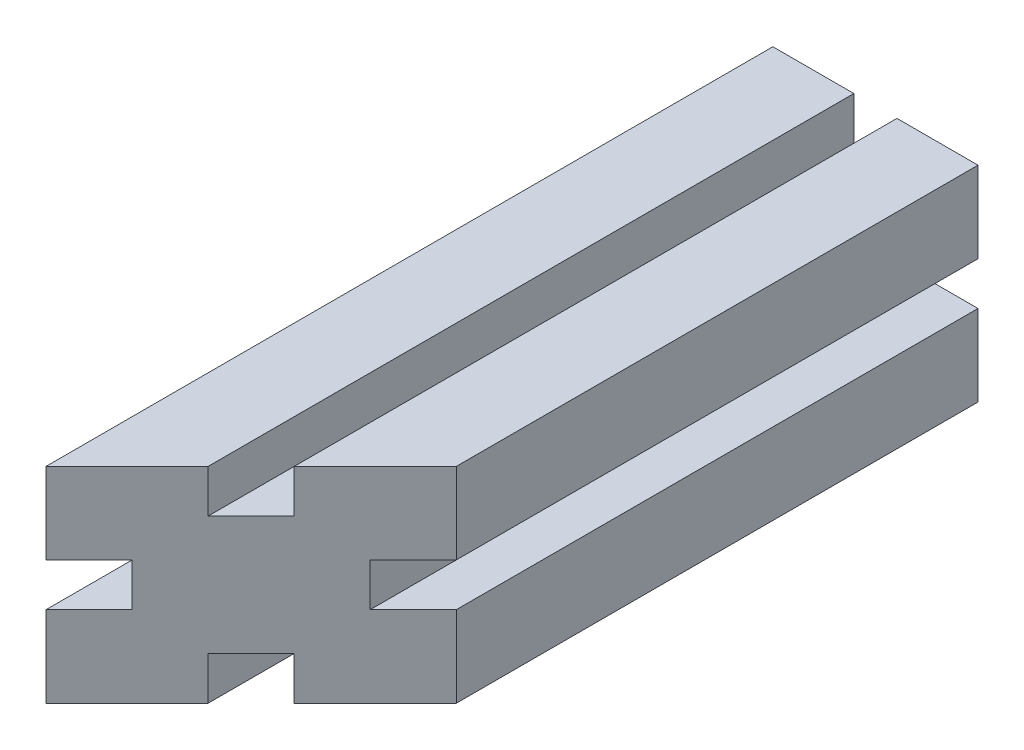
ISO-10303-21;
HEADER;
FILE_DESCRIPTION(('STEP AP214'),'2;1');
FILE_NAME('part.step','',(''),(''),'','','');
FILE_SCHEMA(('AUTOMOTIVE_DESIGN { 1 0 10303 214 1 1 1 1 }'));
ENDSEC;
DATA;
#1=APPLICATION_CONTEXT('core data for automotive mechanical design processes');
#2=APPLICATION_PROTOCOL_DEFINITION('international standard','automotive_design',2000,#1);
#3=PRODUCT_CONTEXT('',#1,'mechanical');
#4=PRODUCT('Part','Part','',(#3));
#5=PRODUCT_RELATED_PRODUCT_CATEGORY('part','',(#4));
#6=PRODUCT_DEFINITION_FORMATION('','',#4);
#7=PRODUCT_DEFINITION_CONTEXT('part definition',#1,'design');
#8=PRODUCT_DEFINITION('design','',#6,#7);
#9=PRODUCT_DEFINITION_SHAPE('','',#8);
#10=(LENGTH_UNIT() NAMED_UNIT(*) SI_UNIT(.MILLI.,.METRE.));
#11=(NAMED_UNIT(*) PLANE_ANGLE_UNIT() SI_UNIT($,.RADIAN.));
#12=(NAMED_UNIT(*) SI_UNIT($,.STERADIAN.) SOLID_ANGLE_UNIT());
#13=UNCERTAINTY_MEASURE_WITH_UNIT(LENGTH_MEASURE(1.E-05),#10,'distance_accuracy_value','');
#14=(GEOMETRIC_REPRESENTATION_CONTEXT(3) GLOBAL_UNCERTAINTY_ASSIGNED_CONTEXT((#13)) GLOBAL_UNIT_ASSIGNED_CONTEXT((#10,
#11,#12)) REPRESENTATION_CONTEXT('',''));
#15=CARTESIAN_POINT('',(0.,0.,0.));
#16=DIRECTION('',(0.,0.,1.));
#17=DIRECTION('',(1.,0.,0.));
#18=AXIS2_PLACEMENT_3D('',#15,#16,#17);
#19=CARTESIAN_POINT('',(-19.05,-4.,135.));
#20=DIRECTION('',(1.,0.,0.));
#21=DIRECTION('',(0.,0.,-1.));
#22=AXIS2_PLACEMENT_3D('',#19,#20,#21);
#23=PLANE('',#22);
#24=DIRECTION('',(0.,-1.,0.));
#25=VECTOR('',#24,1.);
#26=CARTESIAN_POINT('',(-19.05,-4.,0.));
#27=LINE('',#26,#25);
#28=CARTESIAN_POINT('',(-19.05,-4.,0.));
#29=VERTEX_POINT('',#28);
#30=CARTESIAN_POINT('',(-19.05,-19.05,0.));
#31=VERTEX_POINT('',#30);
#32=EDGE_CURVE('E142',#29,#31,#27,.T.);
#33=ORIENTED_EDGE('',*,*,#32,.T.);
#34=DIRECTION('',(0.,0.,-1.));
#35=VECTOR('',#34,1.);
#36=CARTESIAN_POINT('',(-19.05,-19.05,135.));
#37=LINE('',#36,#35);
#38=CARTESIAN_POINT('',(-19.05,-19.05,135.));
#39=VERTEX_POINT('',#38);
#40=EDGE_CURVE('E11',#39,#31,#37,.T.);
#41=ORIENTED_EDGE('',*,*,#40,.F.);
#42=DIRECTION('',(0.,-1.,0.));
#43=VECTOR('',#42,1.);
#44=CARTESIAN_POINT('',(-19.05,-4.,135.));
#45=LINE('',#44,#43);
#46=CARTESIAN_POINT('',(-19.05,-4.,135.));
#47=VERTEX_POINT('',#46);
#48=EDGE_CURVE('E143',#47,#39,#45,.T.);
#49=ORIENTED_EDGE('',*,*,#48,.F.);
#50=DIRECTION('',(0.,0.,-1.));
#51=VECTOR('',#50,1.);
#52=CARTESIAN_POINT('',(-19.05,-4.,135.));
#53=LINE('',#52,#51);
#54=EDGE_CURVE('E128',#47,#29,#53,.T.);
#55=ORIENTED_EDGE('',*,*,#54,.T.);
#56=EDGE_LOOP('',(#33,#41,#49,#55));
#57=FACE_BOUND('',#56,.T.);
#58=ADVANCED_FACE('F39',(#57),#23,.F.);
#59=CARTESIAN_POINT('',(-19.05,-19.05,135.));
#60=DIRECTION('',(0.,1.,0.));
#61=DIRECTION('',(0.,0.,1.));
#62=AXIS2_PLACEMENT_3D('',#59,#60,#61);
#63=PLANE('',#62);
#64=DIRECTION('',(0.,0.,-1.));
#65=VECTOR('',#64,1.);
#66=CARTESIAN_POINT('',(-4.,-19.05,135.));
#67=LINE('',#66,#65);
#68=CARTESIAN_POINT('',(-4.,-19.05,119.95));
#69=VERTEX_POINT('',#68);
#70=CARTESIAN_POINT('',(-4.,-19.05,0.));
#71=VERTEX_POINT('',#70);
#72=EDGE_CURVE('E47',#69,#71,#67,.T.);
#73=ORIENTED_EDGE('',*,*,#72,.F.);
#74=DIRECTION('',(-0.707106781186548,0.,0.707106781186548));
#75=VECTOR('',#74,1.);
#76=CARTESIAN_POINT('',(-19.05,-19.05,135.));
#77=LINE('',#76,#75);
#78=EDGE_CURVE('E313',#69,#39,#77,.T.);
#79=ORIENTED_EDGE('',*,*,#78,.T.);
#80=ORIENTED_EDGE('',*,*,#40,.T.);
#81=DIRECTION('',(1.,0.,0.));
#82=VECTOR('',#81,1.);
#83=CARTESIAN_POINT('',(-19.05,-19.05,0.));
#84=LINE('',#83,#82);
#85=EDGE_CURVE('E197',#31,#71,#84,.T.);
#86=ORIENTED_EDGE('',*,*,#85,.T.);
#87=EDGE_LOOP('',(#73,#79,#80,#86));
#88=FACE_BOUND('',#87,.T.);
#89=ADVANCED_FACE('F198',(#88),#63,.F.);
#90=CARTESIAN_POINT('',(-4.,-19.05,135.));
#91=DIRECTION('',(-1.,0.,0.));
#92=DIRECTION('',(0.,0.,1.));
#93=AXIS2_PLACEMENT_3D('',#90,#91,#92);
#94=PLANE('',#93);
#95=DIRECTION('',(0.,0.,-1.));
#96=VECTOR('',#95,1.);
#97=CARTESIAN_POINT('',(-4.,-11.05,135.));
#98=LINE('',#97,#96);
#99=CARTESIAN_POINT('',(-4.,-11.05,119.95));
#100=VERTEX_POINT('',#99);
#101=CARTESIAN_POINT('',(-4.,-11.05,0.));
#102=VERTEX_POINT('',#101);
#103=EDGE_CURVE('E181',#100,#102,#98,.T.);
#104=ORIENTED_EDGE('',*,*,#103,.F.);
#105=DIRECTION('',(0.,-1.,0.));
#106=VECTOR('',#105,1.);
#107=CARTESIAN_POINT('',(-4.,-19.05,119.95));
#108=LINE('',#107,#106);
#109=EDGE_CURVE('E194',#100,#69,#108,.T.);
#110=ORIENTED_EDGE('',*,*,#109,.T.);
#111=ORIENTED_EDGE('',*,*,#72,.T.);
#112=DIRECTION('',(0.,1.,0.));
#113=VECTOR('',#112,1.);
#114=CARTESIAN_POINT('',(-4.,-19.05,0.));
#115=LINE('',#114,#113);
#116=EDGE_CURVE('E190',#71,#102,#115,.T.);
#117=ORIENTED_EDGE('',*,*,#116,.T.);
#118=EDGE_LOOP('',(#104,#110,#111,#117));
#119=FACE_BOUND('',#118,.T.);
#120=ADVANCED_FACE('F188',(#119),#94,.F.);
#121=CARTESIAN_POINT('',(-4.,-11.05,135.));
#122=DIRECTION('',(0.,1.,0.));
#123=DIRECTION('',(0.,0.,1.));
#124=AXIS2_PLACEMENT_3D('',#121,#122,#123);
#125=PLANE('',#124);
#126=DIRECTION('',(0.,0.,-1.));
#127=VECTOR('',#126,1.);
#128=CARTESIAN_POINT('',(4.,-11.05,135.));
#129=LINE('',#128,#127);
#130=CARTESIAN_POINT('',(4.,-11.05,111.95));
#131=VERTEX_POINT('',#130);
#132=CARTESIAN_POINT('',(4.,-11.05,0.));
#133=VERTEX_POINT('',#132);
#134=EDGE_CURVE('E179',#131,#133,#129,.T.);
#135=ORIENTED_EDGE('',*,*,#134,.F.);
#136=DIRECTION('',(-0.707106781186548,0.,0.707106781186548));
#137=VECTOR('',#136,1.);
#138=CARTESIAN_POINT('',(-11.525,-11.05,127.475));
#139=LINE('',#138,#137);
#140=EDGE_CURVE('E310',#131,#100,#139,.T.);
#141=ORIENTED_EDGE('',*,*,#140,.T.);
#142=ORIENTED_EDGE('',*,*,#103,.T.);
#143=DIRECTION('',(1.,0.,0.));
#144=VECTOR('',#143,1.);
#145=CARTESIAN_POINT('',(-4.,-11.05,0.));
#146=LINE('',#145,#144);
#147=EDGE_CURVE('E203',#102,#133,#146,.T.);
#148=ORIENTED_EDGE('',*,*,#147,.T.);
#149=EDGE_LOOP('',(#135,#141,#142,#148));
#150=FACE_BOUND('',#149,.T.);
#151=ADVANCED_FACE('F317',(#150),#125,.F.);
#152=CARTESIAN_POINT('',(4.,-11.05,135.));
#153=DIRECTION('',(1.,0.,0.));
#154=DIRECTION('',(0.,0.,-1.));
#155=AXIS2_PLACEMENT_3D('',#152,#153,#154);
#156=PLANE('',#155);
#157=DIRECTION('',(0.,0.,-1.));
#158=VECTOR('',#157,1.);
#159=CARTESIAN_POINT('',(4.,-19.05,135.));
#160=LINE('',#159,#158);
#161=CARTESIAN_POINT('',(4.,-19.05,111.95));
#162=VERTEX_POINT('',#161);
#163=CARTESIAN_POINT('',(4.,-19.05,0.));
#164=VERTEX_POINT('',#163);
#165=EDGE_CURVE('E177',#162,#164,#160,.T.);
#166=ORIENTED_EDGE('',*,*,#165,.F.);
#167=DIRECTION('',(0.,1.,0.));
#168=VECTOR('',#167,1.);
#169=CARTESIAN_POINT('',(4.,-11.05,111.95));
#170=LINE('',#169,#168);
#171=EDGE_CURVE('E318',#162,#131,#170,.T.);
#172=ORIENTED_EDGE('',*,*,#171,.T.);
#173=ORIENTED_EDGE('',*,*,#134,.T.);
#174=DIRECTION('',(0.,-1.,0.));
#175=VECTOR('',#174,1.);
#176=CARTESIAN_POINT('',(4.,-11.05,0.));
#177=LINE('',#176,#175);
#178=EDGE_CURVE('E205',#133,#164,#177,.T.);
#179=ORIENTED_EDGE('',*,*,#178,.T.);
#180=EDGE_LOOP('',(#166,#172,#173,#179));
#181=FACE_BOUND('',#180,.T.);
#182=ADVANCED_FACE('F418',(#181),#156,.F.);
#183=CARTESIAN_POINT('',(4.,-19.05,135.));
#184=DIRECTION('',(0.,1.,0.));
#185=DIRECTION('',(0.,0.,1.));
#186=AXIS2_PLACEMENT_3D('',#183,#184,#185);
#187=PLANE('',#186);
#188=DIRECTION('',(0.,0.,-1.));
#189=VECTOR('',#188,1.);
#190=CARTESIAN_POINT('',(19.05,-19.05,135.));
#191=LINE('',#190,#189);
#192=CARTESIAN_POINT('',(19.05,-19.05,96.9));
#193=VERTEX_POINT('',#192);
#194=CARTESIAN_POINT('',(19.05,-19.05,0.));
#195=VERTEX_POINT('',#194);
#196=EDGE_CURVE('E175',#193,#195,#191,.T.);
#197=ORIENTED_EDGE('',*,*,#196,.F.);
#198=EDGE_CURVE('E326',#193,#162,#77,.T.);
#199=ORIENTED_EDGE('',*,*,#198,.T.);
#200=ORIENTED_EDGE('',*,*,#165,.T.);
#201=DIRECTION('',(1.,0.,0.));
#202=VECTOR('',#201,1.);
#203=CARTESIAN_POINT('',(4.,-19.05,0.));
#204=LINE('',#203,#202);
#205=EDGE_CURVE('E211',#164,#195,#204,.T.);
#206=ORIENTED_EDGE('',*,*,#205,.T.);
#207=EDGE_LOOP('',(#197,#199,#200,#206));
#208=FACE_BOUND('',#207,.T.);
#209=ADVANCED_FACE('F363',(#208),#187,.F.);
#210=CARTESIAN_POINT('',(19.05,-19.05,135.));
#211=DIRECTION('',(-1.,0.,0.));
#212=DIRECTION('',(0.,0.,1.));
#213=AXIS2_PLACEMENT_3D('',#210,#211,#212);
#214=PLANE('',#213);
#215=DIRECTION('',(0.,0.,-1.));
#216=VECTOR('',#215,1.);
#217=CARTESIAN_POINT('',(19.05,-4.,135.));
#218=LINE('',#217,#216);
#219=CARTESIAN_POINT('',(19.05,-4.,96.9));
#220=VERTEX_POINT('',#219);
#221=CARTESIAN_POINT('',(19.05,-4.,0.));
#222=VERTEX_POINT('',#221);
#223=EDGE_CURVE('E173',#220,#222,#218,.T.);
#224=ORIENTED_EDGE('',*,*,#223,.F.);
#225=DIRECTION('',(0.,-1.,0.));
#226=VECTOR('',#225,1.);
#227=CARTESIAN_POINT('',(19.05,-19.05,96.9));
#228=LINE('',#227,#226);
#229=EDGE_CURVE('E320',#220,#193,#228,.T.);
#230=ORIENTED_EDGE('',*,*,#229,.T.);
#231=ORIENTED_EDGE('',*,*,#196,.T.);
#232=DIRECTION('',(0.,1.,0.));
#233=VECTOR('',#232,1.);
#234=CARTESIAN_POINT('',(19.05,-19.05,0.));
#235=LINE('',#234,#233);
#236=EDGE_CURVE('E214',#195,#222,#235,.T.);
#237=ORIENTED_EDGE('',*,*,#236,.T.);
#238=EDGE_LOOP('',(#224,#230,#231,#237));
#239=FACE_BOUND('',#238,.T.);
#240=ADVANCED_FACE('F361',(#239),#214,.F.);
#241=CARTESIAN_POINT('',(19.05,-4.,135.));
#242=DIRECTION('',(0.,-1.,0.));
#243=DIRECTION('',(0.,0.,-1.));
#244=AXIS2_PLACEMENT_3D('',#241,#242,#243);
#245=PLANE('',#244);
#246=DIRECTION('',(0.,0.,-1.));
#247=VECTOR('',#246,1.);
#248=CARTESIAN_POINT('',(11.05,-4.,135.));
#249=LINE('',#248,#247);
#250=CARTESIAN_POINT('',(11.05,-4.,104.9));
#251=VERTEX_POINT('',#250);
#252=CARTESIAN_POINT('',(11.05,-4.,0.));
#253=VERTEX_POINT('',#252);
#254=EDGE_CURVE('E171',#251,#253,#249,.T.);
#255=ORIENTED_EDGE('',*,*,#254,.F.);
#256=DIRECTION('',(0.707106781186548,0.,-0.707106781186548));
#257=VECTOR('',#256,1.);
#258=CARTESIAN_POINT('',(0.,-4.,115.95));
#259=LINE('',#258,#257);
#260=EDGE_CURVE('E355',#251,#220,#259,.T.);
#261=ORIENTED_EDGE('',*,*,#260,.T.);
#262=ORIENTED_EDGE('',*,*,#223,.T.);
#263=DIRECTION('',(-1.,0.,0.));
#264=VECTOR('',#263,1.);
#265=CARTESIAN_POINT('',(19.05,-4.,0.));
#266=LINE('',#265,#264);
#267=EDGE_CURVE('E217',#222,#253,#266,.T.);
#268=ORIENTED_EDGE('',*,*,#267,.T.);
#269=EDGE_LOOP('',(#255,#261,#262,#268));
#270=FACE_BOUND('',#269,.T.);
#271=ADVANCED_FACE('F372',(#270),#245,.F.);
#272=CARTESIAN_POINT('',(11.05,-4.,135.));
#273=DIRECTION('',(-1.,0.,0.));
#274=DIRECTION('',(0.,0.,1.));
#275=AXIS2_PLACEMENT_3D('',#272,#273,#274);
#276=PLANE('',#275);
#277=DIRECTION('',(0.,0.,-1.));
#278=VECTOR('',#277,1.);
#279=CARTESIAN_POINT('',(11.05,4.,135.));
#280=LINE('',#279,#278);
#281=CARTESIAN_POINT('',(11.05,4.,104.9));
#282=VERTEX_POINT('',#281);
#283=CARTESIAN_POINT('',(11.05,4.,0.));
#284=VERTEX_POINT('',#283);
#285=EDGE_CURVE('E169',#282,#284,#280,.T.);
#286=ORIENTED_EDGE('',*,*,#285,.F.);
#287=DIRECTION('',(0.,-1.,0.));
#288=VECTOR('',#287,1.);
#289=CARTESIAN_POINT('',(11.05,-4.,104.9));
#290=LINE('',#289,#288);
#291=EDGE_CURVE('E352',#282,#251,#290,.T.);
#292=ORIENTED_EDGE('',*,*,#291,.T.);
#293=ORIENTED_EDGE('',*,*,#254,.T.);
#294=DIRECTION('',(0.,1.,0.));
#295=VECTOR('',#294,1.);
#296=CARTESIAN_POINT('',(11.05,-4.,0.));
#297=LINE('',#296,#295);
#298=EDGE_CURVE('E220',#253,#284,#297,.T.);
#299=ORIENTED_EDGE('',*,*,#298,.T.);
#300=EDGE_LOOP('',(#286,#292,#293,#299));
#301=FACE_BOUND('',#300,.T.);
#302=ADVANCED_FACE('F375',(#301),#276,.F.);
#303=CARTESIAN_POINT('',(11.05,4.,135.));
#304=DIRECTION('',(0.,1.,0.));
#305=DIRECTION('',(0.,0.,1.));
#306=AXIS2_PLACEMENT_3D('',#303,#304,#305);
#307=PLANE('',#306);
#308=DIRECTION('',(0.,0.,-1.));
#309=VECTOR('',#308,1.);
#310=CARTESIAN_POINT('',(19.05,4.,135.));
#311=LINE('',#310,#309);
#312=CARTESIAN_POINT('',(19.05,4.,96.9));
#313=VERTEX_POINT('',#312);
#314=CARTESIAN_POINT('',(19.05,4.,0.));
#315=VERTEX_POINT('',#314);
#316=EDGE_CURVE('E167',#313,#315,#311,.T.);
#317=ORIENTED_EDGE('',*,*,#316,.F.);
#318=DIRECTION('',(-0.707106781186548,0.,0.707106781186548));
#319=VECTOR('',#318,1.);
#320=CARTESIAN_POINT('',(-4.,4.,119.95));
#321=LINE('',#320,#319);
#322=EDGE_CURVE('E349',#313,#282,#321,.T.);
#323=ORIENTED_EDGE('',*,*,#322,.T.);
#324=ORIENTED_EDGE('',*,*,#285,.T.);
#325=DIRECTION('',(1.,0.,0.));
#326=VECTOR('',#325,1.);
#327=CARTESIAN_POINT('',(11.05,4.,0.));
#328=LINE('',#327,#326);
#329=EDGE_CURVE('E223',#284,#315,#328,.T.);
#330=ORIENTED_EDGE('',*,*,#329,.T.);
#331=EDGE_LOOP('',(#317,#323,#324,#330));
#332=FACE_BOUND('',#331,.T.);
#333=ADVANCED_FACE('F378',(#332),#307,.F.);
#334=CARTESIAN_POINT('',(19.05,4.,135.));
#335=DIRECTION('',(-1.,0.,0.));
#336=DIRECTION('',(0.,0.,1.));
#337=AXIS2_PLACEMENT_3D('',#334,#335,#336);
#338=PLANE('',#337);
#339=DIRECTION('',(0.,0.,-1.));
#340=VECTOR('',#339,1.);
#341=CARTESIAN_POINT('',(19.05,19.05,135.));
#342=LINE('',#341,#340);
#343=CARTESIAN_POINT('',(19.05,19.05,96.9));
#344=VERTEX_POINT('',#343);
#345=CARTESIAN_POINT('',(19.05,19.05,0.));
#346=VERTEX_POINT('',#345);
#347=EDGE_CURVE('E165',#344,#346,#342,.T.);
#348=ORIENTED_EDGE('',*,*,#347,.F.);
#349=DIRECTION('',(0.,-1.,0.));
#350=VECTOR('',#349,1.);
#351=CARTESIAN_POINT('',(19.05,4.,96.9));
#352=LINE('',#351,#350);
#353=EDGE_CURVE('E346',#344,#313,#352,.T.);
#354=ORIENTED_EDGE('',*,*,#353,.T.);
#355=ORIENTED_EDGE('',*,*,#316,.T.);
#356=DIRECTION('',(0.,1.,0.));
#357=VECTOR('',#356,1.);
#358=CARTESIAN_POINT('',(19.05,4.,0.));
#359=LINE('',#358,#357);
#360=EDGE_CURVE('E226',#315,#346,#359,.T.);
#361=ORIENTED_EDGE('',*,*,#360,.T.);
#362=EDGE_LOOP('',(#348,#354,#355,#361));
#363=FACE_BOUND('',#362,.T.);
#364=ADVANCED_FACE('F383',(#363),#338,.F.);
#365=CARTESIAN_POINT('',(19.05,19.05,135.));
#366=DIRECTION('',(0.,-1.,0.));
#367=DIRECTION('',(0.,0.,-1.));
#368=AXIS2_PLACEMENT_3D('',#365,#366,#367);
#369=PLANE('',#368);
#370=DIRECTION('',(0.,0.,-1.));
#371=VECTOR('',#370,1.);
#372=CARTESIAN_POINT('',(4.,19.05,135.));
#373=LINE('',#372,#371);
#374=CARTESIAN_POINT('',(4.,19.05,111.95));
#375=VERTEX_POINT('',#374);
#376=CARTESIAN_POINT('',(4.,19.05,0.));
#377=VERTEX_POINT('',#376);
#378=EDGE_CURVE('E163',#375,#377,#373,.T.);
#379=ORIENTED_EDGE('',*,*,#378,.F.);
#380=DIRECTION('',(-0.707106781186548,0.,0.707106781186548));
#381=VECTOR('',#380,1.);
#382=CARTESIAN_POINT('',(-19.05,19.05,135.));
#383=LINE('',#382,#381);
#384=EDGE_CURVE('E327',#344,#375,#383,.T.);
#385=ORIENTED_EDGE('',*,*,#384,.F.);
#386=ORIENTED_EDGE('',*,*,#347,.T.);
#387=DIRECTION('',(-1.,0.,0.));
#388=VECTOR('',#387,1.);
#389=CARTESIAN_POINT('',(19.05,19.05,0.));
#390=LINE('',#389,#388);
#391=EDGE_CURVE('E229',#346,#377,#390,.T.);
#392=ORIENTED_EDGE('',*,*,#391,.T.);
#393=EDGE_LOOP('',(#379,#385,#386,#392));
#394=FACE_BOUND('',#393,.T.);
#395=ADVANCED_FACE('F387',(#394),#369,.F.);
#396=CARTESIAN_POINT('',(4.,19.05,135.));
#397=DIRECTION('',(1.,0.,0.));
#398=DIRECTION('',(0.,0.,-1.));
#399=AXIS2_PLACEMENT_3D('',#396,#397,#398);
#400=PLANE('',#399);
#401=DIRECTION('',(0.,0.,-1.));
#402=VECTOR('',#401,1.);
#403=CARTESIAN_POINT('',(4.,11.05,135.));
#404=LINE('',#403,#402);
#405=CARTESIAN_POINT('',(4.,11.05,111.95));
#406=VERTEX_POINT('',#405);
#407=CARTESIAN_POINT('',(4.,11.05,0.));
#408=VERTEX_POINT('',#407);
#409=EDGE_CURVE('E161',#406,#408,#404,.T.);
#410=ORIENTED_EDGE('',*,*,#409,.F.);
#411=DIRECTION('',(0.,1.,0.));
#412=VECTOR('',#411,1.);
#413=CARTESIAN_POINT('',(4.,19.05,111.95));
#414=LINE('',#413,#412);
#415=EDGE_CURVE('E343',#406,#375,#414,.T.);
#416=ORIENTED_EDGE('',*,*,#415,.T.);
#417=ORIENTED_EDGE('',*,*,#378,.T.);
#418=DIRECTION('',(0.,-1.,0.));
#419=VECTOR('',#418,1.);
#420=CARTESIAN_POINT('',(4.,19.05,0.));
#421=LINE('',#420,#419);
#422=EDGE_CURVE('E232',#377,#408,#421,.T.);
#423=ORIENTED_EDGE('',*,*,#422,.T.);
#424=EDGE_LOOP('',(#410,#416,#417,#423));
#425=FACE_BOUND('',#424,.T.);
#426=ADVANCED_FACE('F391',(#425),#400,.F.);
#427=CARTESIAN_POINT('',(4.,11.05,135.));
#428=DIRECTION('',(0.,-1.,0.));
#429=DIRECTION('',(0.,0.,-1.));
#430=AXIS2_PLACEMENT_3D('',#427,#428,#429);
#431=PLANE('',#430);
#432=DIRECTION('',(0.,0.,-1.));
#433=VECTOR('',#432,1.);
#434=CARTESIAN_POINT('',(-4.,11.05,135.));
#435=LINE('',#434,#433);
#436=CARTESIAN_POINT('',(-4.,11.05,119.95));
#437=VERTEX_POINT('',#436);
#438=CARTESIAN_POINT('',(-4.,11.05,0.));
#439=VERTEX_POINT('',#438);
#440=EDGE_CURVE('E159',#437,#439,#435,.T.);
#441=ORIENTED_EDGE('',*,*,#440,.F.);
#442=DIRECTION('',(0.707106781186548,0.,-0.707106781186548));
#443=VECTOR('',#442,1.);
#444=CARTESIAN_POINT('',(-7.525,11.05,123.475));
#445=LINE('',#444,#443);
#446=EDGE_CURVE('E340',#437,#406,#445,.T.);
#447=ORIENTED_EDGE('',*,*,#446,.T.);
#448=ORIENTED_EDGE('',*,*,#409,.T.);
#449=DIRECTION('',(-1.,0.,0.));
#450=VECTOR('',#449,1.);
#451=CARTESIAN_POINT('',(4.,11.05,0.));
#452=LINE('',#451,#450);
#453=EDGE_CURVE('E235',#408,#439,#452,.T.);
#454=ORIENTED_EDGE('',*,*,#453,.T.);
#455=EDGE_LOOP('',(#441,#447,#448,#454));
#456=FACE_BOUND('',#455,.T.);
#457=ADVANCED_FACE('F395',(#456),#431,.F.);
#458=CARTESIAN_POINT('',(-4.,11.05,135.));
#459=DIRECTION('',(-1.,0.,0.));
#460=DIRECTION('',(0.,0.,1.));
#461=AXIS2_PLACEMENT_3D('',#458,#459,#460);
#462=PLANE('',#461);
#463=DIRECTION('',(0.,0.,-1.));
#464=VECTOR('',#463,1.);
#465=CARTESIAN_POINT('',(-4.,19.05,135.));
#466=LINE('',#465,#464);
#467=CARTESIAN_POINT('',(-3.99999999999999,19.05,119.95));
#468=VERTEX_POINT('',#467);
#469=CARTESIAN_POINT('',(-4.,19.05,0.));
#470=VERTEX_POINT('',#469);
#471=EDGE_CURVE('E157',#468,#470,#466,.T.);
#472=ORIENTED_EDGE('',*,*,#471,.F.);
#473=DIRECTION('',(0.,-1.,0.));
#474=VECTOR('',#473,1.);
#475=CARTESIAN_POINT('',(-4.,11.05,119.95));
#476=LINE('',#475,#474);
#477=EDGE_CURVE('E337',#468,#437,#476,.T.);
#478=ORIENTED_EDGE('',*,*,#477,.T.);
#479=ORIENTED_EDGE('',*,*,#440,.T.);
#480=DIRECTION('',(0.,1.,0.));
#481=VECTOR('',#480,1.);
#482=CARTESIAN_POINT('',(-4.,11.05,0.));
#483=LINE('',#482,#481);
#484=EDGE_CURVE('E238',#439,#470,#483,.T.);
#485=ORIENTED_EDGE('',*,*,#484,.T.);
#486=EDGE_LOOP('',(#472,#478,#479,#485));
#487=FACE_BOUND('',#486,.T.);
#488=ADVANCED_FACE('F397',(#487),#462,.F.);
#489=CARTESIAN_POINT('',(-4.,19.05,135.));
#490=DIRECTION('',(0.,-1.,0.));
#491=DIRECTION('',(0.,0.,-1.));
#492=AXIS2_PLACEMENT_3D('',#489,#490,#491);
#493=PLANE('',#492);
#494=DIRECTION('',(0.,0.,-1.));
#495=VECTOR('',#494,1.);
#496=CARTESIAN_POINT('',(-19.05,19.05,135.));
#497=LINE('',#496,#495);
#498=CARTESIAN_POINT('',(-19.05,19.05,135.));
#499=VERTEX_POINT('',#498);
#500=CARTESIAN_POINT('',(-19.05,19.05,0.));
#501=VERTEX_POINT('',#500);
#502=EDGE_CURVE('E154',#499,#501,#497,.T.);
#503=ORIENTED_EDGE('',*,*,#502,.F.);
#504=EDGE_CURVE('E264',#468,#499,#383,.T.);
#505=ORIENTED_EDGE('',*,*,#504,.F.);
#506=ORIENTED_EDGE('',*,*,#471,.T.);
#507=DIRECTION('',(-1.,0.,0.));
#508=VECTOR('',#507,1.);
#509=CARTESIAN_POINT('',(-4.,19.05,0.));
#510=LINE('',#509,#508);
#511=EDGE_CURVE('E241',#470,#501,#510,.T.);
#512=ORIENTED_EDGE('',*,*,#511,.T.);
#513=EDGE_LOOP('',(#503,#505,#506,#512));
#514=FACE_BOUND('',#513,.T.);
#515=ADVANCED_FACE('F261',(#514),#493,.F.);
#516=CARTESIAN_POINT('',(-19.05,19.05,135.));
#517=DIRECTION('',(1.,0.,0.));
#518=DIRECTION('',(0.,0.,-1.));
#519=AXIS2_PLACEMENT_3D('',#516,#517,#518);
#520=PLANE('',#519);
#521=DIRECTION('',(0.,-1.,0.));
#522=VECTOR('',#521,1.);
#523=CARTESIAN_POINT('',(-19.05,19.05,0.));
#524=LINE('',#523,#522);
#525=CARTESIAN_POINT('',(-19.05,4.,0.));
#526=VERTEX_POINT('',#525);
#527=EDGE_CURVE('E243',#501,#526,#524,.T.);
#528=ORIENTED_EDGE('',*,*,#527,.T.);
#529=DIRECTION('',(0.,0.,-1.));
#530=VECTOR('',#529,1.);
#531=CARTESIAN_POINT('',(-19.05,4.,135.));
#532=LINE('',#531,#530);
#533=CARTESIAN_POINT('',(-19.05,3.99999999999999,135.));
#534=VERTEX_POINT('',#533);
#535=EDGE_CURVE('E151',#534,#526,#532,.T.);
#536=ORIENTED_EDGE('',*,*,#535,.F.);
#537=DIRECTION('',(0.,-1.,0.));
#538=VECTOR('',#537,1.);
#539=CARTESIAN_POINT('',(-19.05,19.05,135.));
#540=LINE('',#539,#538);
#541=EDGE_CURVE('E145',#499,#534,#540,.T.);
#542=ORIENTED_EDGE('',*,*,#541,.F.);
#543=ORIENTED_EDGE('',*,*,#502,.T.);
#544=EDGE_LOOP('',(#528,#536,#542,#543));
#545=FACE_BOUND('',#544,.T.);
#546=ADVANCED_FACE('F253',(#545),#520,.F.);
#547=CARTESIAN_POINT('',(-19.05,4.,135.));
#548=DIRECTION('',(0.,1.,0.));
#549=DIRECTION('',(0.,0.,1.));
#550=AXIS2_PLACEMENT_3D('',#547,#548,#549);
#551=PLANE('',#550);
#552=DIRECTION('',(0.,0.,-1.));
#553=VECTOR('',#552,1.);
#554=CARTESIAN_POINT('',(-11.05,4.,135.));
#555=LINE('',#554,#553);
#556=CARTESIAN_POINT('',(-11.05,4.,127.));
#557=VERTEX_POINT('',#556);
#558=CARTESIAN_POINT('',(-11.05,4.,0.));
#559=VERTEX_POINT('',#558);
#560=EDGE_CURVE('E127',#557,#559,#555,.T.);
#561=ORIENTED_EDGE('',*,*,#560,.F.);
#562=DIRECTION('',(-0.707106781186548,0.,0.707106781186548));
#563=VECTOR('',#562,1.);
#564=CARTESIAN_POINT('',(-19.05,4.,135.));
#565=LINE('',#564,#563);
#566=EDGE_CURVE('E335',#557,#534,#565,.T.);
#567=ORIENTED_EDGE('',*,*,#566,.T.);
#568=ORIENTED_EDGE('',*,*,#535,.T.);
#569=DIRECTION('',(1.,0.,0.));
#570=VECTOR('',#569,1.);
#571=CARTESIAN_POINT('',(-19.05,4.,0.));
#572=LINE('',#571,#570);
#573=EDGE_CURVE('E137',#526,#559,#572,.T.);
#574=ORIENTED_EDGE('',*,*,#573,.T.);
#575=EDGE_LOOP('',(#561,#567,#568,#574));
#576=FACE_BOUND('',#575,.T.);
#577=ADVANCED_FACE('F245',(#576),#551,.F.);
#578=CARTESIAN_POINT('',(-11.05,4.,135.));
#579=DIRECTION('',(1.,0.,0.));
#580=DIRECTION('',(0.,0.,-1.));
#581=AXIS2_PLACEMENT_3D('',#578,#579,#580);
#582=PLANE('',#581);
#583=DIRECTION('',(0.,0.,-1.));
#584=VECTOR('',#583,1.);
#585=CARTESIAN_POINT('',(-11.05,-4.,135.));
#586=LINE('',#585,#584);
#587=CARTESIAN_POINT('',(-11.05,-4.,127.));
#588=VERTEX_POINT('',#587);
#589=CARTESIAN_POINT('',(-11.05,-4.,0.));
#590=VERTEX_POINT('',#589);
#591=EDGE_CURVE('E118',#588,#590,#586,.T.);
#592=ORIENTED_EDGE('',*,*,#591,.F.);
#593=DIRECTION('',(0.,1.,0.));
#594=VECTOR('',#593,1.);
#595=CARTESIAN_POINT('',(-11.05,4.,127.));
#596=LINE('',#595,#594);
#597=EDGE_CURVE('E333',#588,#557,#596,.T.);
#598=ORIENTED_EDGE('',*,*,#597,.T.);
#599=ORIENTED_EDGE('',*,*,#560,.T.);
#600=DIRECTION('',(0.,-1.,0.));
#601=VECTOR('',#600,1.);
#602=CARTESIAN_POINT('',(-11.05,4.,0.));
#603=LINE('',#602,#601);
#604=EDGE_CURVE('E131',#559,#590,#603,.T.);
#605=ORIENTED_EDGE('',*,*,#604,.T.);
#606=EDGE_LOOP('',(#592,#598,#599,#605));
#607=FACE_BOUND('',#606,.T.);
#608=ADVANCED_FACE('F132',(#607),#582,.F.);
#609=CARTESIAN_POINT('',(-11.05,-4.,135.));
#610=DIRECTION('',(0.,-1.,0.));
#611=DIRECTION('',(0.,0.,-1.));
#612=AXIS2_PLACEMENT_3D('',#609,#610,#611);
#613=PLANE('',#612);
#614=ORIENTED_EDGE('',*,*,#54,.F.);
#615=DIRECTION('',(0.707106781186548,0.,-0.707106781186548));
#616=VECTOR('',#615,1.);
#617=CARTESIAN_POINT('',(-15.05,-4.,131.));
#618=LINE('',#617,#616);
#619=EDGE_CURVE('E54',#47,#588,#618,.T.);
#620=ORIENTED_EDGE('',*,*,#619,.T.);
#621=ORIENTED_EDGE('',*,*,#591,.T.);
#622=DIRECTION('',(-1.,0.,0.));
#623=VECTOR('',#622,1.);
#624=CARTESIAN_POINT('',(-11.05,-4.,0.));
#625=LINE('',#624,#623);
#626=EDGE_CURVE('E122',#590,#29,#625,.T.);
#627=ORIENTED_EDGE('',*,*,#626,.T.);
#628=EDGE_LOOP('',(#614,#620,#621,#627));
#629=FACE_BOUND('',#628,.T.);
#630=ADVANCED_FACE('F120',(#629),#613,.F.);
#631=CARTESIAN_POINT('',(0.,0.,0.));
#632=DIRECTION('',(0.,0.,1.));
#633=DIRECTION('',(1.,0.,0.));
#634=AXIS2_PLACEMENT_3D('',#631,#632,#633);
#635=PLANE('',#634);
#636=ORIENTED_EDGE('',*,*,#32,.F.);
#637=ORIENTED_EDGE('',*,*,#626,.F.);
#638=ORIENTED_EDGE('',*,*,#604,.F.);
#639=ORIENTED_EDGE('',*,*,#573,.F.);
#640=ORIENTED_EDGE('',*,*,#527,.F.);
#641=ORIENTED_EDGE('',*,*,#511,.F.);
#642=ORIENTED_EDGE('',*,*,#484,.F.);
#643=ORIENTED_EDGE('',*,*,#453,.F.);
#644=ORIENTED_EDGE('',*,*,#422,.F.);
#645=ORIENTED_EDGE('',*,*,#391,.F.);
#646=ORIENTED_EDGE('',*,*,#360,.F.);
#647=ORIENTED_EDGE('',*,*,#329,.F.);
#648=ORIENTED_EDGE('',*,*,#298,.F.);
#649=ORIENTED_EDGE('',*,*,#267,.F.);
#650=ORIENTED_EDGE('',*,*,#236,.F.);
#651=ORIENTED_EDGE('',*,*,#205,.F.);
#652=ORIENTED_EDGE('',*,*,#178,.F.);
#653=ORIENTED_EDGE('',*,*,#147,.F.);
#654=ORIENTED_EDGE('',*,*,#116,.F.);
#655=ORIENTED_EDGE('',*,*,#85,.F.);
#656=EDGE_LOOP('',(#636,#637,#638,#639,#640,#641,#642,#643,#644,#645,#646,#647,#648,#649,#650,
#651,#652,#653,#654,#655));
#657=FACE_BOUND('',#656,.T.);
#658=ADVANCED_FACE('F140',(#657),#635,.F.);
#659=CARTESIAN_POINT('',(-19.05,-19.05,135.));
#660=DIRECTION('',(-0.707106781186548,0.,-0.707106781186548));
#661=DIRECTION('',(-0.707106781186548,0.,0.707106781186548));
#662=AXIS2_PLACEMENT_3D('',#659,#660,#661);
#663=PLANE('',#662);
#664=ORIENTED_EDGE('',*,*,#140,.F.);
#665=ORIENTED_EDGE('',*,*,#171,.F.);
#666=ORIENTED_EDGE('',*,*,#198,.F.);
#667=ORIENTED_EDGE('',*,*,#229,.F.);
#668=ORIENTED_EDGE('',*,*,#260,.F.);
#669=ORIENTED_EDGE('',*,*,#291,.F.);
#670=ORIENTED_EDGE('',*,*,#322,.F.);
#671=ORIENTED_EDGE('',*,*,#353,.F.);
#672=ORIENTED_EDGE('',*,*,#384,.T.);
#673=ORIENTED_EDGE('',*,*,#415,.F.);
#674=ORIENTED_EDGE('',*,*,#446,.F.);
#675=ORIENTED_EDGE('',*,*,#477,.F.);
#676=ORIENTED_EDGE('',*,*,#504,.T.);
#677=ORIENTED_EDGE('',*,*,#541,.T.);
#678=ORIENTED_EDGE('',*,*,#566,.F.);
#679=ORIENTED_EDGE('',*,*,#597,.F.);
#680=ORIENTED_EDGE('',*,*,#619,.F.);
#681=ORIENTED_EDGE('',*,*,#48,.T.);
#682=ORIENTED_EDGE('',*,*,#78,.F.);
#683=ORIENTED_EDGE('',*,*,#109,.F.);
#684=EDGE_LOOP('',(#664,#665,#666,#667,#668,#669,#670,#671,#672,#673,#674,#675,#676,#677,#678,
#679,#680,#681,#682,#683));
#685=FACE_BOUND('',#684,.T.);
#686=ADVANCED_FACE('F312',(#685),#663,.F.);
#687=CLOSED_SHELL('',(#58,#89,#120,#151,#182,#209,#240,#271,#302,#333,#364,#395,#426,#457,#488,
#515,#546,#577,#608,#630,#658,#686));
#688=MANIFOLD_SOLID_BREP('B2',#687);
#689=ADVANCED_BREP_SHAPE_REPRESENTATION('',(#18,#688),#14);
#690=SHAPE_DEFINITION_REPRESENTATION(#9,#689);
ENDSEC;
END-ISO-10303-21;
